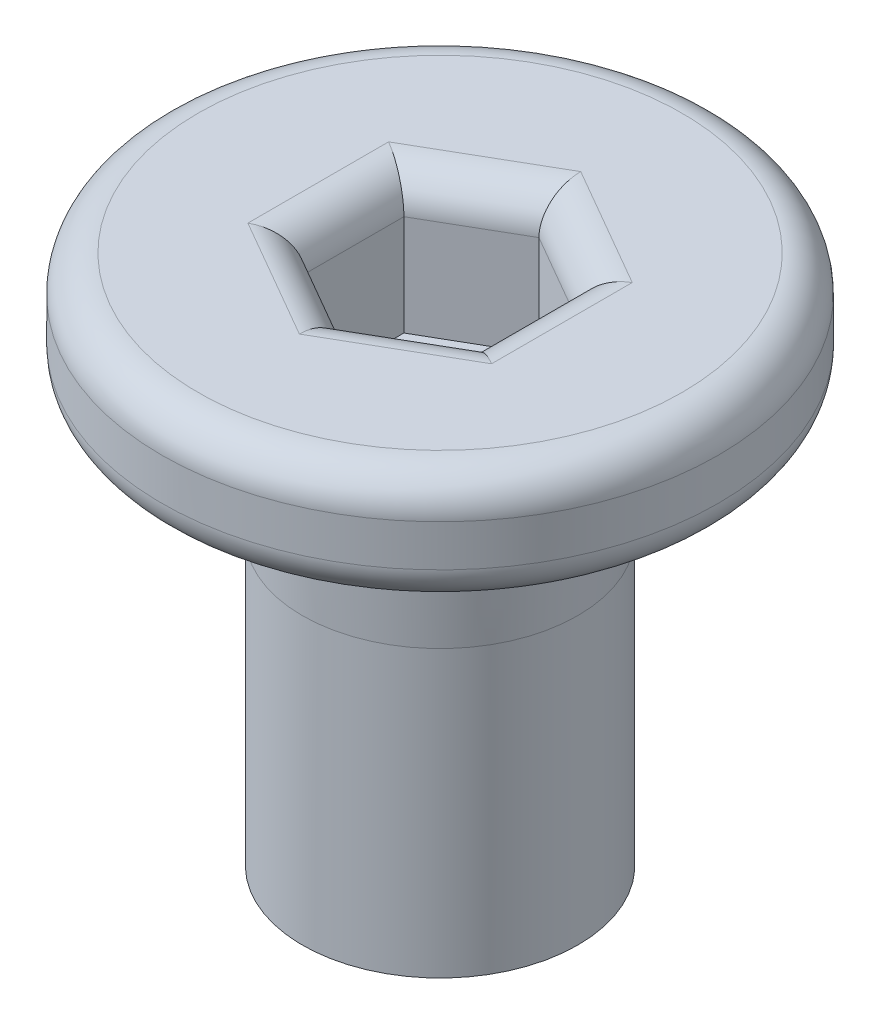
ISO-10303-21;
HEADER;
FILE_DESCRIPTION(('STEP AP214'),'2;1');
FILE_NAME('part.step','',(''),(''),'','','');
FILE_SCHEMA(('AUTOMOTIVE_DESIGN { 1 0 10303 214 1 1 1 1 }'));
ENDSEC;
DATA;
#1=APPLICATION_CONTEXT('core data for automotive mechanical design processes');
#2=APPLICATION_PROTOCOL_DEFINITION('international standard','automotive_design',2000,#1);
#3=PRODUCT_CONTEXT('',#1,'mechanical');
#4=PRODUCT('Part','Part','',(#3));
#5=PRODUCT_RELATED_PRODUCT_CATEGORY('part','',(#4));
#6=PRODUCT_DEFINITION_FORMATION('','',#4);
#7=PRODUCT_DEFINITION_CONTEXT('part definition',#1,'design');
#8=PRODUCT_DEFINITION('design','',#6,#7);
#9=PRODUCT_DEFINITION_SHAPE('','',#8);
#10=(LENGTH_UNIT() NAMED_UNIT(*) SI_UNIT(.MILLI.,.METRE.));
#11=(NAMED_UNIT(*) PLANE_ANGLE_UNIT() SI_UNIT($,.RADIAN.));
#12=(NAMED_UNIT(*) SI_UNIT($,.STERADIAN.) SOLID_ANGLE_UNIT());
#13=UNCERTAINTY_MEASURE_WITH_UNIT(LENGTH_MEASURE(1.E-05),#10,'distance_accuracy_value','');
#14=(GEOMETRIC_REPRESENTATION_CONTEXT(3) GLOBAL_UNCERTAINTY_ASSIGNED_CONTEXT((#13)) GLOBAL_UNIT_ASSIGNED_CONTEXT((#10,
#11,#12)) REPRESENTATION_CONTEXT('',''));
#15=CARTESIAN_POINT('',(0.,0.,0.));
#16=DIRECTION('',(0.,0.,1.));
#17=DIRECTION('',(1.,0.,0.));
#18=AXIS2_PLACEMENT_3D('',#15,#16,#17);
#19=CARTESIAN_POINT('',(0.,4.65,0.));
#20=DIRECTION('',(0.,1.,0.));
#21=DIRECTION('',(-1.,0.,0.));
#22=AXIS2_PLACEMENT_3D('',#19,#20,#21);
#23=PLANE('',#22);
#24=DIRECTION('',(0.,0.,1.));
#25=VECTOR('',#24,1.);
#26=CARTESIAN_POINT('',(-2.135,4.65,-0.86602540378444));
#27=LINE('',#26,#25);
#28=CARTESIAN_POINT('',(-2.135,4.65,1.23264282471985));
#29=VERTEX_POINT('',#28);
#30=CARTESIAN_POINT('',(-2.135,4.65,-1.23264282471985));
#31=VERTEX_POINT('',#30);
#32=EDGE_CURVE('E184',#29,#31,#27,.F.);
#33=ORIENTED_EDGE('',*,*,#32,.T.);
#34=DIRECTION('',(-0.866025403784439,0.,0.5));
#35=VECTOR('',#34,1.);
#36=CARTESIAN_POINT('',(-0.317500000000001,4.65,-2.281976938972));
#37=LINE('',#36,#35);
#38=CARTESIAN_POINT('',(0.,4.65,-2.4652856494397));
#39=VERTEX_POINT('',#38);
#40=EDGE_CURVE('E186',#31,#39,#37,.F.);
#41=ORIENTED_EDGE('',*,*,#40,.T.);
#42=DIRECTION('',(-0.866025403784439,0.,-0.5));
#43=VECTOR('',#42,1.);
#44=CARTESIAN_POINT('',(1.8175,4.65,-1.41595153518756));
#45=LINE('',#44,#43);
#46=CARTESIAN_POINT('',(2.135,4.65,-1.23264282471985));
#47=VERTEX_POINT('',#46);
#48=EDGE_CURVE('E176',#39,#47,#45,.F.);
#49=ORIENTED_EDGE('',*,*,#48,.T.);
#50=DIRECTION('',(0.,0.,-1.));
#51=VECTOR('',#50,1.);
#52=CARTESIAN_POINT('',(2.135,4.65,0.86602540378444));
#53=LINE('',#52,#51);
#54=CARTESIAN_POINT('',(2.135,4.65,1.23264282471985));
#55=VERTEX_POINT('',#54);
#56=EDGE_CURVE('E178',#47,#55,#53,.F.);
#57=ORIENTED_EDGE('',*,*,#56,.T.);
#58=DIRECTION('',(0.866025403784439,0.,-0.5));
#59=VECTOR('',#58,1.);
#60=CARTESIAN_POINT('',(0.317500000000002,4.65,2.281976938972));
#61=LINE('',#60,#59);
#62=CARTESIAN_POINT('',(0.,4.65,2.4652856494397));
#63=VERTEX_POINT('',#62);
#64=EDGE_CURVE('E180',#55,#63,#61,.F.);
#65=ORIENTED_EDGE('',*,*,#64,.T.);
#66=DIRECTION('',(0.866025403784439,0.,0.5));
#67=VECTOR('',#66,1.);
#68=CARTESIAN_POINT('',(-1.8175,4.65,1.41595153518756));
#69=LINE('',#68,#67);
#70=EDGE_CURVE('E182',#63,#29,#69,.F.);
#71=ORIENTED_EDGE('',*,*,#70,.T.);
#72=EDGE_LOOP('',(#33,#41,#49,#57,#65,#71));
#73=FACE_BOUND('',#72,.T.);
#74=CARTESIAN_POINT('',(0.,4.65,0.));
#75=DIRECTION('',(0.,1.,0.));
#76=DIRECTION('',(-1.,0.,0.));
#77=AXIS2_PLACEMENT_3D('',#74,#75,#76);
#78=CIRCLE('',#77,4.24000000000001);
#79=CARTESIAN_POINT('',(-4.24000000000001,4.65,0.));
#80=VERTEX_POINT('',#79);
#81=EDGE_CURVE('E171',#80,#80,#78,.T.);
#82=ORIENTED_EDGE('',*,*,#81,.T.);
#83=EDGE_LOOP('',(#82));
#84=FACE_BOUND('',#83,.T.);
#85=ADVANCED_FACE('F32',(#73,#84),#23,.T.);
#86=CARTESIAN_POINT('',(0.,-4.65,0.));
#87=DIRECTION('',(0.,-1.,0.));
#88=DIRECTION('',(1.,0.,0.));
#89=AXIS2_PLACEMENT_3D('',#86,#87,#88);
#90=CYLINDRICAL_SURFACE('',#89,4.87500000000001);
#91=CARTESIAN_POINT('',(0.,4.015,0.));
#92=DIRECTION('',(0.,1.,0.));
#93=DIRECTION('',(-1.,0.,0.));
#94=AXIS2_PLACEMENT_3D('',#91,#92,#93);
#95=CIRCLE('',#94,4.87500000000001);
#96=CARTESIAN_POINT('',(-4.87500000000001,4.015,0.));
#97=VERTEX_POINT('',#96);
#98=EDGE_CURVE('E168',#97,#97,#95,.F.);
#99=ORIENTED_EDGE('',*,*,#98,.T.);
#100=EDGE_LOOP('',(#99));
#101=FACE_BOUND('',#100,.T.);
#102=CARTESIAN_POINT('',(0.,3.285,0.));
#103=DIRECTION('',(0.,-1.,0.));
#104=DIRECTION('',(1.,0.,0.));
#105=AXIS2_PLACEMENT_3D('',#102,#103,#104);
#106=CIRCLE('',#105,4.87500000000001);
#107=CARTESIAN_POINT('',(4.87500000000001,3.285,0.));
#108=VERTEX_POINT('',#107);
#109=EDGE_CURVE('E165',#108,#108,#106,.F.);
#110=ORIENTED_EDGE('',*,*,#109,.T.);
#111=EDGE_LOOP('',(#110));
#112=FACE_BOUND('',#111,.T.);
#113=ADVANCED_FACE('F246',(#101,#112),#90,.T.);
#114=CARTESIAN_POINT('',(4.875,2.65,0.));
#115=DIRECTION('',(0.,-1.,0.));
#116=DIRECTION('',(1.,0.,0.));
#117=AXIS2_PLACEMENT_3D('',#114,#115,#116);
#118=PLANE('',#117);
#119=CARTESIAN_POINT('',(0.,2.65,0.));
#120=DIRECTION('',(0.,-1.,0.));
#121=DIRECTION('',(1.,0.,0.));
#122=AXIS2_PLACEMENT_3D('',#119,#120,#121);
#123=CIRCLE('',#122,3.11143455548153);
#124=CARTESIAN_POINT('',(3.11143455548152,2.65,0.));
#125=VERTEX_POINT('',#124);
#126=EDGE_CURVE('E162',#125,#125,#123,.F.);
#127=ORIENTED_EDGE('',*,*,#126,.T.);
#128=EDGE_LOOP('',(#127));
#129=FACE_BOUND('',#128,.T.);
#130=CARTESIAN_POINT('',(0.,2.65,0.));
#131=DIRECTION('',(0.,-1.,0.));
#132=DIRECTION('',(1.,0.,0.));
#133=AXIS2_PLACEMENT_3D('',#130,#131,#132);
#134=CIRCLE('',#133,4.24000000000001);
#135=CARTESIAN_POINT('',(4.24000000000001,2.65,0.));
#136=VERTEX_POINT('',#135);
#137=EDGE_CURVE('E159',#136,#136,#134,.T.);
#138=ORIENTED_EDGE('',*,*,#137,.T.);
#139=EDGE_LOOP('',(#138));
#140=FACE_BOUND('',#139,.T.);
#141=ADVANCED_FACE('F252',(#129,#140),#118,.T.);
#142=CARTESIAN_POINT('',(0.,0.349999999999998,0.));
#143=DIRECTION('',(0.,1.,0.));
#144=DIRECTION('',(-1.,0.,0.));
#145=AXIS2_PLACEMENT_3D('',#142,#143,#144);
#146=CONICAL_SURFACE('',#145,2.413,0.0378080617445996);
#147=CARTESIAN_POINT('',(0.,2.03900239988414,0.));
#148=DIRECTION('',(0.,1.,0.));
#149=DIRECTION('',(-1.,0.,0.));
#150=AXIS2_PLACEMENT_3D('',#147,#148,#149);
#151=CIRCLE('',#150,2.47688835164779);
#152=CARTESIAN_POINT('',(-2.47688835164779,2.03900239988414,0.));
#153=VERTEX_POINT('',#152);
#154=EDGE_CURVE('E156',#153,#153,#151,.F.);
#155=ORIENTED_EDGE('',*,*,#154,.T.);
#156=EDGE_LOOP('',(#155));
#157=FACE_BOUND('',#156,.T.);
#158=CARTESIAN_POINT('',(0.,0.349999999999998,0.));
#159=DIRECTION('',(0.,-1.,0.));
#160=DIRECTION('',(1.,0.,0.));
#161=AXIS2_PLACEMENT_3D('',#158,#159,#160);
#162=CIRCLE('',#161,2.413);
#163=CARTESIAN_POINT('',(2.413,0.349999999999998,0.));
#164=VERTEX_POINT('',#163);
#165=EDGE_CURVE('E153',#164,#164,#162,.T.);
#166=ORIENTED_EDGE('',*,*,#165,.F.);
#167=EDGE_LOOP('',(#166));
#168=FACE_BOUND('',#167,.T.);
#169=ADVANCED_FACE('F302',(#157,#168),#146,.T.);
#170=CARTESIAN_POINT('',(0.,-4.65,0.));
#171=DIRECTION('',(0.,-1.,0.));
#172=DIRECTION('',(1.,0.,0.));
#173=AXIS2_PLACEMENT_3D('',#170,#171,#172);
#174=CYLINDRICAL_SURFACE('',#173,2.413);
#175=ORIENTED_EDGE('',*,*,#165,.T.);
#176=EDGE_LOOP('',(#175));
#177=FACE_BOUND('',#176,.T.);
#178=CARTESIAN_POINT('',(0.,-4.65,0.));
#179=DIRECTION('',(0.,-1.,0.));
#180=DIRECTION('',(1.,0.,0.));
#181=AXIS2_PLACEMENT_3D('',#178,#179,#180);
#182=CIRCLE('',#181,2.413);
#183=CARTESIAN_POINT('',(2.413,-4.65,0.));
#184=VERTEX_POINT('',#183);
#185=EDGE_CURVE('E142',#184,#184,#182,.T.);
#186=ORIENTED_EDGE('',*,*,#185,.F.);
#187=EDGE_LOOP('',(#186));
#188=FACE_BOUND('',#187,.T.);
#189=ADVANCED_FACE('F298',(#177,#188),#174,.T.);
#190=CARTESIAN_POINT('',(2.413,-4.65,0.));
#191=DIRECTION('',(0.,-1.,0.));
#192=DIRECTION('',(1.,0.,0.));
#193=AXIS2_PLACEMENT_3D('',#190,#191,#192);
#194=PLANE('',#193);
#195=ORIENTED_EDGE('',*,*,#185,.T.);
#196=EDGE_LOOP('',(#195));
#197=FACE_BOUND('',#196,.T.);
#198=ADVANCED_FACE('F262',(#197),#194,.T.);
#199=CARTESIAN_POINT('',(0.,2.015,0.));
#200=DIRECTION('',(0.,-1.,0.));
#201=DIRECTION('',(1.,0.,0.));
#202=AXIS2_PLACEMENT_3D('',#199,#200,#201);
#203=TOROIDAL_SURFACE('',#202,3.11143455548153,0.635);
#204=ORIENTED_EDGE('',*,*,#126,.F.);
#205=EDGE_LOOP('',(#204));
#206=FACE_BOUND('',#205,.T.);
#207=ORIENTED_EDGE('',*,*,#154,.F.);
#208=EDGE_LOOP('',(#207));
#209=FACE_BOUND('',#208,.T.);
#210=ADVANCED_FACE('F258',(#206,#209),#203,.F.);
#211=CARTESIAN_POINT('',(0.,4.015,0.));
#212=DIRECTION('',(0.,1.,0.));
#213=DIRECTION('',(-1.,0.,0.));
#214=AXIS2_PLACEMENT_3D('',#211,#212,#213);
#215=TOROIDAL_SURFACE('',#214,4.24000000000001,0.635);
#216=ORIENTED_EDGE('',*,*,#81,.F.);
#217=EDGE_LOOP('',(#216));
#218=FACE_BOUND('',#217,.T.);
#219=ORIENTED_EDGE('',*,*,#98,.F.);
#220=EDGE_LOOP('',(#219));
#221=FACE_BOUND('',#220,.T.);
#222=ADVANCED_FACE('F261',(#218,#221),#215,.T.);
#223=CARTESIAN_POINT('',(0.,3.285,0.));
#224=DIRECTION('',(0.,-1.,0.));
#225=DIRECTION('',(1.,0.,0.));
#226=AXIS2_PLACEMENT_3D('',#223,#224,#225);
#227=TOROIDAL_SURFACE('',#226,4.24000000000001,0.635);
#228=ORIENTED_EDGE('',*,*,#109,.F.);
#229=EDGE_LOOP('',(#228));
#230=FACE_BOUND('',#229,.T.);
#231=ORIENTED_EDGE('',*,*,#137,.F.);
#232=EDGE_LOOP('',(#231));
#233=FACE_BOUND('',#232,.T.);
#234=ADVANCED_FACE('F242',(#230,#233),#227,.T.);
#235=CARTESIAN_POINT('',(1.5,2.25,-0.866025403784438));
#236=DIRECTION('',(0.5,0.,-0.866025403784438));
#237=DIRECTION('',(-0.866025403784439,0.,-0.5));
#238=AXIS2_PLACEMENT_3D('',#235,#236,#237);
#239=PLANE('',#238);
#240=DIRECTION('',(0.,1.,0.));
#241=VECTOR('',#240,1.);
#242=CARTESIAN_POINT('',(1.5,2.25,-0.866025403784438));
#243=LINE('',#242,#241);
#244=CARTESIAN_POINT('',(1.5,2.25,-0.866025403784438));
#245=VERTEX_POINT('',#244);
#246=CARTESIAN_POINT('',(1.5,4.015,-0.866025403784438));
#247=VERTEX_POINT('',#246);
#248=EDGE_CURVE('E140',#245,#247,#243,.T.);
#249=ORIENTED_EDGE('',*,*,#248,.T.);
#250=DIRECTION('',(-0.866025403784439,0.,-0.5));
#251=VECTOR('',#250,1.);
#252=CARTESIAN_POINT('',(0.,4.015,-1.73205080756888));
#253=LINE('',#252,#251);
#254=CARTESIAN_POINT('',(0.,4.015,-1.73205080756888));
#255=VERTEX_POINT('',#254);
#256=EDGE_CURVE('E11',#247,#255,#253,.T.);
#257=ORIENTED_EDGE('',*,*,#256,.T.);
#258=DIRECTION('',(0.,1.,0.));
#259=VECTOR('',#258,1.);
#260=CARTESIAN_POINT('',(0.,2.25,-1.73205080756888));
#261=LINE('',#260,#259);
#262=CARTESIAN_POINT('',(0.,2.25,-1.73205080756888));
#263=VERTEX_POINT('',#262);
#264=EDGE_CURVE('E104',#263,#255,#261,.T.);
#265=ORIENTED_EDGE('',*,*,#264,.F.);
#266=DIRECTION('',(-0.866025403784438,0.,-0.5));
#267=VECTOR('',#266,1.);
#268=CARTESIAN_POINT('',(1.5,2.25,-0.866025403784438));
#269=LINE('',#268,#267);
#270=EDGE_CURVE('E108',#245,#263,#269,.T.);
#271=ORIENTED_EDGE('',*,*,#270,.F.);
#272=EDGE_LOOP('',(#249,#257,#265,#271));
#273=FACE_BOUND('',#272,.T.);
#274=ADVANCED_FACE('F106',(#273),#239,.F.);
#275=CARTESIAN_POINT('',(1.5,2.25,0.86602540378444));
#276=DIRECTION('',(1.,0.,0.));
#277=DIRECTION('',(0.,0.,-1.));
#278=AXIS2_PLACEMENT_3D('',#275,#276,#277);
#279=PLANE('',#278);
#280=DIRECTION('',(0.,1.,0.));
#281=VECTOR('',#280,1.);
#282=CARTESIAN_POINT('',(1.5,2.25,0.86602540378444));
#283=LINE('',#282,#281);
#284=CARTESIAN_POINT('',(1.5,2.25,0.86602540378444));
#285=VERTEX_POINT('',#284);
#286=CARTESIAN_POINT('',(1.5,4.015,0.86602540378444));
#287=VERTEX_POINT('',#286);
#288=EDGE_CURVE('E143',#285,#287,#283,.T.);
#289=ORIENTED_EDGE('',*,*,#288,.T.);
#290=DIRECTION('',(0.,0.,-1.));
#291=VECTOR('',#290,1.);
#292=CARTESIAN_POINT('',(1.5,4.015,-0.866025403784438));
#293=LINE('',#292,#291);
#294=EDGE_CURVE('E41',#287,#247,#293,.T.);
#295=ORIENTED_EDGE('',*,*,#294,.T.);
#296=ORIENTED_EDGE('',*,*,#248,.F.);
#297=DIRECTION('',(0.,0.,-1.));
#298=VECTOR('',#297,1.);
#299=CARTESIAN_POINT('',(1.5,2.25,0.86602540378444));
#300=LINE('',#299,#298);
#301=EDGE_CURVE('E115',#285,#245,#300,.T.);
#302=ORIENTED_EDGE('',*,*,#301,.F.);
#303=EDGE_LOOP('',(#289,#295,#296,#302));
#304=FACE_BOUND('',#303,.T.);
#305=ADVANCED_FACE('F234',(#304),#279,.F.);
#306=CARTESIAN_POINT('',(0.,2.25,1.73205080756888));
#307=DIRECTION('',(0.5,0.,0.866025403784439));
#308=DIRECTION('',(0.866025403784439,0.,-0.5));
#309=AXIS2_PLACEMENT_3D('',#306,#307,#308);
#310=PLANE('',#309);
#311=DIRECTION('',(0.,1.,0.));
#312=VECTOR('',#311,1.);
#313=CARTESIAN_POINT('',(0.,2.25,1.73205080756888));
#314=LINE('',#313,#312);
#315=CARTESIAN_POINT('',(0.,2.25,1.73205080756888));
#316=VERTEX_POINT('',#315);
#317=CARTESIAN_POINT('',(0.,4.015,1.73205080756888));
#318=VERTEX_POINT('',#317);
#319=EDGE_CURVE('E145',#316,#318,#314,.T.);
#320=ORIENTED_EDGE('',*,*,#319,.T.);
#321=DIRECTION('',(0.866025403784439,0.,-0.5));
#322=VECTOR('',#321,1.);
#323=CARTESIAN_POINT('',(1.5,4.015,0.866025403784441));
#324=LINE('',#323,#322);
#325=EDGE_CURVE('E56',#318,#287,#324,.T.);
#326=ORIENTED_EDGE('',*,*,#325,.T.);
#327=ORIENTED_EDGE('',*,*,#288,.F.);
#328=DIRECTION('',(0.866025403784439,0.,-0.5));
#329=VECTOR('',#328,1.);
#330=CARTESIAN_POINT('',(0.,2.25,1.73205080756888));
#331=LINE('',#330,#329);
#332=EDGE_CURVE('E137',#316,#285,#331,.T.);
#333=ORIENTED_EDGE('',*,*,#332,.F.);
#334=EDGE_LOOP('',(#320,#326,#327,#333));
#335=FACE_BOUND('',#334,.T.);
#336=ADVANCED_FACE('F233',(#335),#310,.F.);
#337=CARTESIAN_POINT('',(-1.5,2.25,0.866025403784438));
#338=DIRECTION('',(-0.5,0.,0.866025403784439));
#339=DIRECTION('',(0.866025403784439,0.,0.5));
#340=AXIS2_PLACEMENT_3D('',#337,#338,#339);
#341=PLANE('',#340);
#342=DIRECTION('',(0.,1.,0.));
#343=VECTOR('',#342,1.);
#344=CARTESIAN_POINT('',(-1.5,2.25,0.866025403784438));
#345=LINE('',#344,#343);
#346=CARTESIAN_POINT('',(-1.5,2.25,0.866025403784438));
#347=VERTEX_POINT('',#346);
#348=CARTESIAN_POINT('',(-1.5,4.015,0.866025403784438));
#349=VERTEX_POINT('',#348);
#350=EDGE_CURVE('E147',#347,#349,#345,.T.);
#351=ORIENTED_EDGE('',*,*,#350,.T.);
#352=DIRECTION('',(0.866025403784439,0.,0.5));
#353=VECTOR('',#352,1.);
#354=CARTESIAN_POINT('',(0.,4.015,1.73205080756888));
#355=LINE('',#354,#353);
#356=EDGE_CURVE('E191',#349,#318,#355,.T.);
#357=ORIENTED_EDGE('',*,*,#356,.T.);
#358=ORIENTED_EDGE('',*,*,#319,.F.);
#359=DIRECTION('',(0.866025403784439,0.,0.5));
#360=VECTOR('',#359,1.);
#361=CARTESIAN_POINT('',(-1.5,2.25,0.866025403784438));
#362=LINE('',#361,#360);
#363=EDGE_CURVE('E134',#347,#316,#362,.T.);
#364=ORIENTED_EDGE('',*,*,#363,.F.);
#365=EDGE_LOOP('',(#351,#357,#358,#364));
#366=FACE_BOUND('',#365,.T.);
#367=ADVANCED_FACE('F232',(#366),#341,.F.);
#368=CARTESIAN_POINT('',(-1.5,2.25,-0.86602540378444));
#369=DIRECTION('',(-1.,0.,0.));
#370=DIRECTION('',(0.,-1.,0.));
#371=AXIS2_PLACEMENT_3D('',#368,#369,#370);
#372=PLANE('',#371);
#373=DIRECTION('',(0.,1.,0.));
#374=VECTOR('',#373,1.);
#375=CARTESIAN_POINT('',(-1.5,2.25,-0.86602540378444));
#376=LINE('',#375,#374);
#377=CARTESIAN_POINT('',(-1.5,2.25,-0.86602540378444));
#378=VERTEX_POINT('',#377);
#379=CARTESIAN_POINT('',(-1.5,4.015,-0.86602540378444));
#380=VERTEX_POINT('',#379);
#381=EDGE_CURVE('E114',#378,#380,#376,.T.);
#382=ORIENTED_EDGE('',*,*,#381,.T.);
#383=DIRECTION('',(0.,0.,1.));
#384=VECTOR('',#383,1.);
#385=CARTESIAN_POINT('',(-1.5,4.015,0.866025403784438));
#386=LINE('',#385,#384);
#387=EDGE_CURVE('E189',#380,#349,#386,.T.);
#388=ORIENTED_EDGE('',*,*,#387,.T.);
#389=ORIENTED_EDGE('',*,*,#350,.F.);
#390=DIRECTION('',(0.,0.,1.));
#391=VECTOR('',#390,1.);
#392=CARTESIAN_POINT('',(-1.5,2.25,-0.86602540378444));
#393=LINE('',#392,#391);
#394=EDGE_CURVE('E124',#378,#347,#393,.T.);
#395=ORIENTED_EDGE('',*,*,#394,.F.);
#396=EDGE_LOOP('',(#382,#388,#389,#395));
#397=FACE_BOUND('',#396,.T.);
#398=ADVANCED_FACE('F228',(#397),#372,.F.);
#399=CARTESIAN_POINT('',(0.,2.25,-1.73205080756888));
#400=DIRECTION('',(-0.5,0.,-0.866025403784439));
#401=DIRECTION('',(-0.866025403784439,0.,0.5));
#402=AXIS2_PLACEMENT_3D('',#399,#400,#401);
#403=PLANE('',#402);
#404=ORIENTED_EDGE('',*,*,#264,.T.);
#405=DIRECTION('',(-0.866025403784439,0.,0.5));
#406=VECTOR('',#405,1.);
#407=CARTESIAN_POINT('',(-1.5,4.015,-0.86602540378444));
#408=LINE('',#407,#406);
#409=EDGE_CURVE('E174',#255,#380,#408,.T.);
#410=ORIENTED_EDGE('',*,*,#409,.T.);
#411=ORIENTED_EDGE('',*,*,#381,.F.);
#412=DIRECTION('',(-0.866025403784439,0.,0.5));
#413=VECTOR('',#412,1.);
#414=CARTESIAN_POINT('',(0.,2.25,-1.73205080756888));
#415=LINE('',#414,#413);
#416=EDGE_CURVE('E118',#263,#378,#415,.T.);
#417=ORIENTED_EDGE('',*,*,#416,.F.);
#418=EDGE_LOOP('',(#404,#410,#411,#417));
#419=FACE_BOUND('',#418,.T.);
#420=ADVANCED_FACE('F119',(#419),#403,.F.);
#421=CARTESIAN_POINT('',(0.,2.25,0.));
#422=DIRECTION('',(0.,1.,0.));
#423=DIRECTION('',(0.,0.,1.));
#424=AXIS2_PLACEMENT_3D('',#421,#422,#423);
#425=PLANE('',#424);
#426=ORIENTED_EDGE('',*,*,#270,.T.);
#427=ORIENTED_EDGE('',*,*,#416,.T.);
#428=ORIENTED_EDGE('',*,*,#394,.T.);
#429=ORIENTED_EDGE('',*,*,#363,.T.);
#430=ORIENTED_EDGE('',*,*,#332,.T.);
#431=ORIENTED_EDGE('',*,*,#301,.T.);
#432=EDGE_LOOP('',(#426,#427,#428,#429,#430,#431));
#433=FACE_BOUND('',#432,.T.);
#434=ADVANCED_FACE('F126',(#433),#425,.T.);
#435=CARTESIAN_POINT('',(0.317500000000002,4.015,2.281976938972));
#436=DIRECTION('',(-0.866025403784439,0.,0.5));
#437=DIRECTION('',(0.5,0.,0.866025403784439));
#438=AXIS2_PLACEMENT_3D('',#435,#436,#437);
#439=CYLINDRICAL_SURFACE('',#438,0.635);
#440=CARTESIAN_POINT('',(0.,4.015,2.4652856494397));
#441=DIRECTION('',(-1.,0.,0.));
#442=DIRECTION('',(0.,0.,-1.));
#443=AXIS2_PLACEMENT_3D('',#440,#441,#442);
#444=ELLIPSE('',#443,0.733234841870825,0.635);
#445=EDGE_CURVE('E131',#63,#318,#444,.T.);
#446=ORIENTED_EDGE('',*,*,#445,.F.);
#447=ORIENTED_EDGE('',*,*,#64,.F.);
#448=CARTESIAN_POINT('',(2.135,4.015,1.23264282471985));
#449=DIRECTION('',(-0.5,0.,0.866025403784439));
#450=DIRECTION('',(-0.866025403784439,0.,-0.5));
#451=AXIS2_PLACEMENT_3D('',#448,#449,#450);
#452=ELLIPSE('',#451,0.733234841870825,0.635);
#453=EDGE_CURVE('E36',#287,#55,#452,.F.);
#454=ORIENTED_EDGE('',*,*,#453,.F.);
#455=ORIENTED_EDGE('',*,*,#325,.F.);
#456=EDGE_LOOP('',(#446,#447,#454,#455));
#457=FACE_BOUND('',#456,.T.);
#458=ADVANCED_FACE('F34',(#457),#439,.T.);
#459=CARTESIAN_POINT('',(2.135,4.015,0.86602540378444));
#460=DIRECTION('',(0.,0.,1.));
#461=DIRECTION('',(1.,0.,0.));
#462=AXIS2_PLACEMENT_3D('',#459,#460,#461);
#463=CYLINDRICAL_SURFACE('',#462,0.635);
#464=ORIENTED_EDGE('',*,*,#453,.T.);
#465=ORIENTED_EDGE('',*,*,#56,.F.);
#466=CARTESIAN_POINT('',(2.135,4.015,-1.23264282471985));
#467=DIRECTION('',(0.5,0.,0.866025403784439));
#468=DIRECTION('',(-0.866025403784439,0.,0.5));
#469=AXIS2_PLACEMENT_3D('',#466,#467,#468);
#470=ELLIPSE('',#469,0.733234841870825,0.635);
#471=EDGE_CURVE('E202',#247,#47,#470,.F.);
#472=ORIENTED_EDGE('',*,*,#471,.F.);
#473=ORIENTED_EDGE('',*,*,#294,.F.);
#474=EDGE_LOOP('',(#464,#465,#472,#473));
#475=FACE_BOUND('',#474,.T.);
#476=ADVANCED_FACE('F217',(#475),#463,.T.);
#477=CARTESIAN_POINT('',(-1.8175,4.015,1.41595153518756));
#478=DIRECTION('',(-0.866025403784439,0.,-0.5));
#479=DIRECTION('',(-0.5,0.,0.866025403784439));
#480=AXIS2_PLACEMENT_3D('',#477,#478,#479);
#481=CYLINDRICAL_SURFACE('',#480,0.635);
#482=ORIENTED_EDGE('',*,*,#445,.T.);
#483=ORIENTED_EDGE('',*,*,#356,.F.);
#484=CARTESIAN_POINT('',(-2.135,4.015,1.23264282471985));
#485=DIRECTION('',(-0.5,0.,-0.866025403784439));
#486=DIRECTION('',(0.866025403784439,0.,-0.5));
#487=AXIS2_PLACEMENT_3D('',#484,#485,#486);
#488=ELLIPSE('',#487,0.733234841870825,0.635);
#489=EDGE_CURVE('E199',#29,#349,#488,.T.);
#490=ORIENTED_EDGE('',*,*,#489,.F.);
#491=ORIENTED_EDGE('',*,*,#70,.F.);
#492=EDGE_LOOP('',(#482,#483,#490,#491));
#493=FACE_BOUND('',#492,.T.);
#494=ADVANCED_FACE('F209',(#493),#481,.T.);
#495=CARTESIAN_POINT('',(1.8175,4.015,-1.41595153518756));
#496=DIRECTION('',(0.866025403784439,0.,0.5));
#497=DIRECTION('',(0.5,0.,-0.866025403784439));
#498=AXIS2_PLACEMENT_3D('',#495,#496,#497);
#499=CYLINDRICAL_SURFACE('',#498,0.635);
#500=ORIENTED_EDGE('',*,*,#471,.T.);
#501=ORIENTED_EDGE('',*,*,#48,.F.);
#502=CARTESIAN_POINT('',(0.,4.015,-2.4652856494397));
#503=DIRECTION('',(1.,0.,0.));
#504=DIRECTION('',(0.,0.,-1.));
#505=AXIS2_PLACEMENT_3D('',#502,#503,#504);
#506=ELLIPSE('',#505,0.733234841870825,0.635);
#507=EDGE_CURVE('E197',#255,#39,#506,.F.);
#508=ORIENTED_EDGE('',*,*,#507,.F.);
#509=ORIENTED_EDGE('',*,*,#256,.F.);
#510=EDGE_LOOP('',(#500,#501,#508,#509));
#511=FACE_BOUND('',#510,.T.);
#512=ADVANCED_FACE('F220',(#511),#499,.T.);
#513=CARTESIAN_POINT('',(-2.135,4.015,-0.86602540378444));
#514=DIRECTION('',(0.,0.,-1.));
#515=DIRECTION('',(-1.,0.,0.));
#516=AXIS2_PLACEMENT_3D('',#513,#514,#515);
#517=CYLINDRICAL_SURFACE('',#516,0.635);
#518=ORIENTED_EDGE('',*,*,#489,.T.);
#519=ORIENTED_EDGE('',*,*,#387,.F.);
#520=CARTESIAN_POINT('',(-2.135,4.015,-1.23264282471985));
#521=DIRECTION('',(0.5,0.,-0.866025403784439));
#522=DIRECTION('',(0.866025403784439,0.,0.5));
#523=AXIS2_PLACEMENT_3D('',#520,#521,#522);
#524=ELLIPSE('',#523,0.733234841870825,0.635);
#525=EDGE_CURVE('E195',#31,#380,#524,.T.);
#526=ORIENTED_EDGE('',*,*,#525,.F.);
#527=ORIENTED_EDGE('',*,*,#32,.F.);
#528=EDGE_LOOP('',(#518,#519,#526,#527));
#529=FACE_BOUND('',#528,.T.);
#530=ADVANCED_FACE('F272',(#529),#517,.T.);
#531=CARTESIAN_POINT('',(-0.317500000000001,4.015,-2.281976938972));
#532=DIRECTION('',(0.866025403784439,0.,-0.5));
#533=DIRECTION('',(-0.5,0.,-0.866025403784439));
#534=AXIS2_PLACEMENT_3D('',#531,#532,#533);
#535=CYLINDRICAL_SURFACE('',#534,0.635);
#536=ORIENTED_EDGE('',*,*,#507,.T.);
#537=ORIENTED_EDGE('',*,*,#40,.F.);
#538=ORIENTED_EDGE('',*,*,#525,.T.);
#539=ORIENTED_EDGE('',*,*,#409,.F.);
#540=EDGE_LOOP('',(#536,#537,#538,#539));
#541=FACE_BOUND('',#540,.T.);
#542=ADVANCED_FACE('F224',(#541),#535,.T.);
#543=CLOSED_SHELL('',(#85,#113,#141,#169,#189,#198,#210,#222,#234,#274,#305,#336,#367,#398,#420,
#434,#458,#476,#494,#512,#530,#542));
#544=MANIFOLD_SOLID_BREP('B2',#543);
#545=ADVANCED_BREP_SHAPE_REPRESENTATION('',(#18,#544),#14);
#546=SHAPE_DEFINITION_REPRESENTATION(#9,#545);
ENDSEC;
END-ISO-10303-21;
